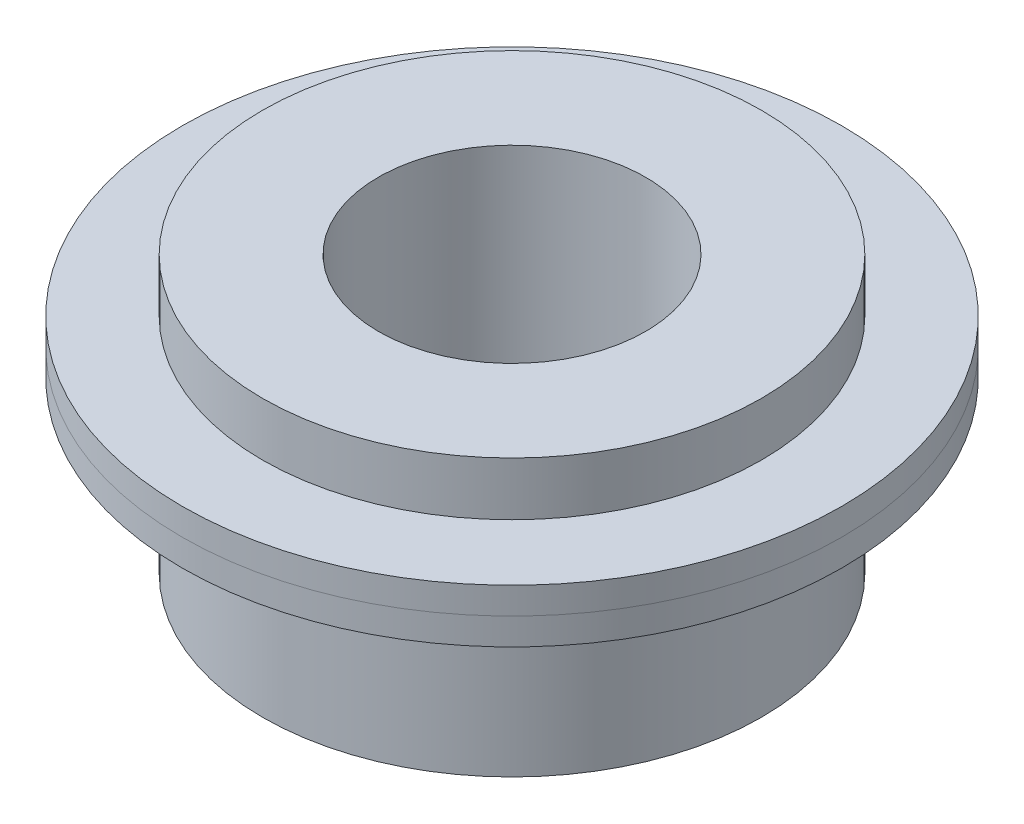
ISO-10303-21;
HEADER;
FILE_DESCRIPTION(('STEP AP214'),'2;1');
FILE_NAME('part.step','',(''),(''),'','','');
FILE_SCHEMA(('AUTOMOTIVE_DESIGN { 1 0 10303 214 1 1 1 1 }'));
ENDSEC;
DATA;
#1=APPLICATION_CONTEXT('core data for automotive mechanical design processes');
#2=APPLICATION_PROTOCOL_DEFINITION('international standard','automotive_design',2000,#1);
#3=PRODUCT_CONTEXT('',#1,'mechanical');
#4=PRODUCT('Part','Part','',(#3));
#5=PRODUCT_RELATED_PRODUCT_CATEGORY('part','',(#4));
#6=PRODUCT_DEFINITION_FORMATION('','',#4);
#7=PRODUCT_DEFINITION_CONTEXT('part definition',#1,'design');
#8=PRODUCT_DEFINITION('design','',#6,#7);
#9=PRODUCT_DEFINITION_SHAPE('','',#8);
#10=(LENGTH_UNIT() NAMED_UNIT(*) SI_UNIT(.MILLI.,.METRE.));
#11=(NAMED_UNIT(*) PLANE_ANGLE_UNIT() SI_UNIT($,.RADIAN.));
#12=(NAMED_UNIT(*) SI_UNIT($,.STERADIAN.) SOLID_ANGLE_UNIT());
#13=UNCERTAINTY_MEASURE_WITH_UNIT(LENGTH_MEASURE(1.E-05),#10,'distance_accuracy_value','');
#14=(GEOMETRIC_REPRESENTATION_CONTEXT(3) GLOBAL_UNCERTAINTY_ASSIGNED_CONTEXT((#13)) GLOBAL_UNIT_ASSIGNED_CONTEXT((#10,
#11,#12)) REPRESENTATION_CONTEXT('',''));
#15=CARTESIAN_POINT('',(0.,0.,0.));
#16=DIRECTION('',(0.,0.,1.));
#17=DIRECTION('',(1.,0.,0.));
#18=AXIS2_PLACEMENT_3D('',#15,#16,#17);
#19=CARTESIAN_POINT('',(0.,-1.44701986754967,0.));
#20=DIRECTION('',(0.,1.,0.));
#21=DIRECTION('',(0.,0.,1.));
#22=AXIS2_PLACEMENT_3D('',#19,#20,#21);
#23=CYLINDRICAL_SURFACE('',#22,18.5);
#24=CARTESIAN_POINT('',(0.,-1.44701986754967,0.));
#25=DIRECTION('',(0.,-1.,0.));
#26=DIRECTION('',(0.,0.,-1.));
#27=AXIS2_PLACEMENT_3D('',#24,#25,#26);
#28=CIRCLE('',#27,18.5);
#29=CARTESIAN_POINT('',(0.,-1.44701986754967,-18.5));
#30=VERTEX_POINT('',#29);
#31=EDGE_CURVE('E54',#30,#30,#28,.T.);
#32=ORIENTED_EDGE('',*,*,#31,.F.);
#33=EDGE_LOOP('',(#32));
#34=FACE_BOUND('',#33,.T.);
#35=CARTESIAN_POINT('',(0.,0.0529801324503314,0.));
#36=DIRECTION('',(0.,-1.,0.));
#37=DIRECTION('',(0.,0.,-1.));
#38=AXIS2_PLACEMENT_3D('',#35,#36,#37);
#39=CIRCLE('',#38,18.5);
#40=CARTESIAN_POINT('',(0.,0.0529801324503314,-18.5));
#41=VERTEX_POINT('',#40);
#42=EDGE_CURVE('E60',#41,#41,#39,.T.);
#43=ORIENTED_EDGE('',*,*,#42,.T.);
#44=EDGE_LOOP('',(#43));
#45=FACE_BOUND('',#44,.T.);
#46=ADVANCED_FACE('F47',(#34,#45),#23,.T.);
#47=CARTESIAN_POINT('',(0.,-1.44701986754967,0.));
#48=DIRECTION('',(0.,1.,0.));
#49=DIRECTION('',(0.,0.,1.));
#50=AXIS2_PLACEMENT_3D('',#47,#48,#49);
#51=CYLINDRICAL_SURFACE('',#50,14.);
#52=CARTESIAN_POINT('',(0.,-1.44701986754967,0.));
#53=DIRECTION('',(0.,-1.,0.));
#54=DIRECTION('',(0.,0.,-1.));
#55=AXIS2_PLACEMENT_3D('',#52,#53,#54);
#56=CIRCLE('',#55,14.);
#57=CARTESIAN_POINT('',(0.,-1.44701986754967,-14.));
#58=VERTEX_POINT('',#57);
#59=EDGE_CURVE('E11',#58,#58,#56,.F.);
#60=ORIENTED_EDGE('',*,*,#59,.F.);
#61=EDGE_LOOP('',(#60));
#62=FACE_BOUND('',#61,.T.);
#63=CARTESIAN_POINT('',(0.,0.0529801324503314,0.));
#64=DIRECTION('',(0.,-1.,0.));
#65=DIRECTION('',(0.,0.,-1.));
#66=AXIS2_PLACEMENT_3D('',#63,#64,#65);
#67=CIRCLE('',#66,14.);
#68=CARTESIAN_POINT('',(0.,0.0529801324503314,-14.));
#69=VERTEX_POINT('',#68);
#70=EDGE_CURVE('E50',#69,#69,#67,.F.);
#71=ORIENTED_EDGE('',*,*,#70,.T.);
#72=EDGE_LOOP('',(#71));
#73=FACE_BOUND('',#72,.T.);
#74=ADVANCED_FACE('F67',(#62,#73),#51,.F.);
#75=CARTESIAN_POINT('',(0.,-1.44701986754967,0.));
#76=DIRECTION('',(0.,-1.,0.));
#77=DIRECTION('',(0.,0.,-1.));
#78=AXIS2_PLACEMENT_3D('',#75,#76,#77);
#79=PLANE('',#78);
#80=ORIENTED_EDGE('',*,*,#31,.T.);
#81=EDGE_LOOP('',(#80));
#82=FACE_BOUND('',#81,.T.);
#83=ORIENTED_EDGE('',*,*,#59,.T.);
#84=EDGE_LOOP('',(#83));
#85=FACE_BOUND('',#84,.T.);
#86=ADVANCED_FACE('F71',(#82,#85),#79,.T.);
#87=CARTESIAN_POINT('',(0.,0.0529801324503314,0.));
#88=DIRECTION('',(0.,-1.,0.));
#89=DIRECTION('',(0.,0.,-1.));
#90=AXIS2_PLACEMENT_3D('',#87,#88,#89);
#91=PLANE('',#90);
#92=ORIENTED_EDGE('',*,*,#42,.F.);
#93=EDGE_LOOP('',(#92));
#94=FACE_BOUND('',#93,.T.);
#95=ORIENTED_EDGE('',*,*,#70,.F.);
#96=EDGE_LOOP('',(#95));
#97=FACE_BOUND('',#96,.T.);
#98=ADVANCED_FACE('F69',(#94,#97),#91,.F.);
#99=CLOSED_SHELL('',(#46,#74,#86,#98));
#100=MANIFOLD_SOLID_BREP('B2',#99);
#101=CARTESIAN_POINT('',(0.,7.46688741721854,0.));
#102=DIRECTION('',(0.,1.,0.));
#103=DIRECTION('',(0.,0.,1.));
#104=AXIS2_PLACEMENT_3D('',#101,#102,#103);
#105=CYLINDRICAL_SURFACE('',#104,7.5);
#106=CARTESIAN_POINT('',(0.,4.55298013245033,0.));
#107=DIRECTION('',(0.,1.,0.));
#108=DIRECTION('',(0.,0.,1.));
#109=AXIS2_PLACEMENT_3D('',#106,#107,#108);
#110=CIRCLE('',#109,7.5);
#111=CARTESIAN_POINT('',(0.,4.55298013245033,7.5));
#112=VERTEX_POINT('',#111);
#113=EDGE_CURVE('E46',#112,#112,#110,.T.);
#114=ORIENTED_EDGE('',*,*,#113,.T.);
#115=EDGE_LOOP('',(#114));
#116=FACE_BOUND('',#115,.T.);
#117=CARTESIAN_POINT('',(0.,-10.9470198675497,0.));
#118=DIRECTION('',(0.,1.,0.));
#119=DIRECTION('',(0.,0.,1.));
#120=AXIS2_PLACEMENT_3D('',#117,#118,#119);
#121=CIRCLE('',#120,7.5);
#122=CARTESIAN_POINT('',(0.,-10.9470198675497,7.5));
#123=VERTEX_POINT('',#122);
#124=EDGE_CURVE('E140',#123,#123,#121,.T.);
#125=ORIENTED_EDGE('',*,*,#124,.F.);
#126=EDGE_LOOP('',(#125));
#127=FACE_BOUND('',#126,.T.);
#128=ADVANCED_FACE('F112',(#116,#127),#105,.F.);
#129=CARTESIAN_POINT('',(-7.5,4.55298013245033,0.));
#130=DIRECTION('',(0.,1.,0.));
#131=DIRECTION('',(0.,0.,1.));
#132=AXIS2_PLACEMENT_3D('',#129,#130,#131);
#133=PLANE('',#132);
#134=CARTESIAN_POINT('',(0.,4.55298013245033,0.));
#135=DIRECTION('',(0.,1.,0.));
#136=DIRECTION('',(0.,0.,1.));
#137=AXIS2_PLACEMENT_3D('',#134,#135,#136);
#138=CIRCLE('',#137,14.);
#139=CARTESIAN_POINT('',(0.,4.55298013245033,14.));
#140=VERTEX_POINT('',#139);
#141=EDGE_CURVE('E118',#140,#140,#138,.T.);
#142=ORIENTED_EDGE('',*,*,#141,.T.);
#143=EDGE_LOOP('',(#142));
#144=FACE_BOUND('',#143,.T.);
#145=ORIENTED_EDGE('',*,*,#113,.F.);
#146=EDGE_LOOP('',(#145));
#147=FACE_BOUND('',#146,.T.);
#148=ADVANCED_FACE('F148',(#144,#147),#133,.T.);
#149=CARTESIAN_POINT('',(0.,7.46688741721854,0.));
#150=DIRECTION('',(0.,1.,0.));
#151=DIRECTION('',(0.,0.,1.));
#152=AXIS2_PLACEMENT_3D('',#149,#150,#151);
#153=CYLINDRICAL_SURFACE('',#152,14.);
#154=CARTESIAN_POINT('',(0.,1.55298013245033,0.));
#155=DIRECTION('',(0.,1.,0.));
#156=DIRECTION('',(0.,0.,1.));
#157=AXIS2_PLACEMENT_3D('',#154,#155,#156);
#158=CIRCLE('',#157,14.);
#159=CARTESIAN_POINT('',(0.,1.55298013245033,14.));
#160=VERTEX_POINT('',#159);
#161=EDGE_CURVE('E122',#160,#160,#158,.T.);
#162=ORIENTED_EDGE('',*,*,#161,.T.);
#163=EDGE_LOOP('',(#162));
#164=FACE_BOUND('',#163,.T.);
#165=ORIENTED_EDGE('',*,*,#141,.F.);
#166=EDGE_LOOP('',(#165));
#167=FACE_BOUND('',#166,.T.);
#168=ADVANCED_FACE('F152',(#164,#167),#153,.T.);
#169=CARTESIAN_POINT('',(-14.,1.55298013245033,0.));
#170=DIRECTION('',(0.,1.,0.));
#171=DIRECTION('',(0.,0.,1.));
#172=AXIS2_PLACEMENT_3D('',#169,#170,#171);
#173=PLANE('',#172);
#174=CARTESIAN_POINT('',(0.,1.55298013245033,0.));
#175=DIRECTION('',(0.,1.,0.));
#176=DIRECTION('',(0.,0.,1.));
#177=AXIS2_PLACEMENT_3D('',#174,#175,#176);
#178=CIRCLE('',#177,18.5);
#179=CARTESIAN_POINT('',(0.,1.55298013245033,18.5));
#180=VERTEX_POINT('',#179);
#181=EDGE_CURVE('E126',#180,#180,#178,.T.);
#182=ORIENTED_EDGE('',*,*,#181,.T.);
#183=EDGE_LOOP('',(#182));
#184=FACE_BOUND('',#183,.T.);
#185=ORIENTED_EDGE('',*,*,#161,.F.);
#186=EDGE_LOOP('',(#185));
#187=FACE_BOUND('',#186,.T.);
#188=ADVANCED_FACE('F156',(#184,#187),#173,.T.);
#189=CARTESIAN_POINT('',(0.,7.46688741721854,0.));
#190=DIRECTION('',(0.,1.,0.));
#191=DIRECTION('',(0.,0.,1.));
#192=AXIS2_PLACEMENT_3D('',#189,#190,#191);
#193=CYLINDRICAL_SURFACE('',#192,18.5);
#194=CARTESIAN_POINT('',(0.,0.0529801324503313,0.));
#195=DIRECTION('',(0.,1.,0.));
#196=DIRECTION('',(0.,0.,1.));
#197=AXIS2_PLACEMENT_3D('',#194,#195,#196);
#198=CIRCLE('',#197,18.5);
#199=CARTESIAN_POINT('',(0.,0.0529801324503313,18.5));
#200=VERTEX_POINT('',#199);
#201=EDGE_CURVE('E131',#200,#200,#198,.T.);
#202=ORIENTED_EDGE('',*,*,#201,.T.);
#203=EDGE_LOOP('',(#202));
#204=FACE_BOUND('',#203,.T.);
#205=ORIENTED_EDGE('',*,*,#181,.F.);
#206=EDGE_LOOP('',(#205));
#207=FACE_BOUND('',#206,.T.);
#208=ADVANCED_FACE('F163',(#204,#207),#193,.T.);
#209=CARTESIAN_POINT('',(-14.,0.0529801324503314,0.));
#210=DIRECTION('',(0.,-1.,0.));
#211=DIRECTION('',(0.,0.,-1.));
#212=AXIS2_PLACEMENT_3D('',#209,#210,#211);
#213=PLANE('',#212);
#214=CARTESIAN_POINT('',(0.,0.0529801324503313,0.));
#215=DIRECTION('',(0.,1.,0.));
#216=DIRECTION('',(0.,0.,1.));
#217=AXIS2_PLACEMENT_3D('',#214,#215,#216);
#218=CIRCLE('',#217,14.);
#219=CARTESIAN_POINT('',(0.,0.0529801324503313,14.));
#220=VERTEX_POINT('',#219);
#221=EDGE_CURVE('E134',#220,#220,#218,.T.);
#222=ORIENTED_EDGE('',*,*,#221,.T.);
#223=EDGE_LOOP('',(#222));
#224=FACE_BOUND('',#223,.T.);
#225=ORIENTED_EDGE('',*,*,#201,.F.);
#226=EDGE_LOOP('',(#225));
#227=FACE_BOUND('',#226,.T.);
#228=ADVANCED_FACE('F167',(#224,#227),#213,.T.);
#229=CARTESIAN_POINT('',(0.,7.46688741721854,0.));
#230=DIRECTION('',(0.,1.,0.));
#231=DIRECTION('',(0.,0.,1.));
#232=AXIS2_PLACEMENT_3D('',#229,#230,#231);
#233=CYLINDRICAL_SURFACE('',#232,14.);
#234=CARTESIAN_POINT('',(0.,-10.9470198675497,0.));
#235=DIRECTION('',(0.,1.,0.));
#236=DIRECTION('',(0.,0.,1.));
#237=AXIS2_PLACEMENT_3D('',#234,#235,#236);
#238=CIRCLE('',#237,14.);
#239=CARTESIAN_POINT('',(0.,-10.9470198675497,14.));
#240=VERTEX_POINT('',#239);
#241=EDGE_CURVE('E137',#240,#240,#238,.T.);
#242=ORIENTED_EDGE('',*,*,#241,.T.);
#243=EDGE_LOOP('',(#242));
#244=FACE_BOUND('',#243,.T.);
#245=ORIENTED_EDGE('',*,*,#221,.F.);
#246=EDGE_LOOP('',(#245));
#247=FACE_BOUND('',#246,.T.);
#248=ADVANCED_FACE('F171',(#244,#247),#233,.T.);
#249=CARTESIAN_POINT('',(-14.,-10.9470198675497,0.));
#250=DIRECTION('',(0.,-1.,0.));
#251=DIRECTION('',(0.,0.,-1.));
#252=AXIS2_PLACEMENT_3D('',#249,#250,#251);
#253=PLANE('',#252);
#254=ORIENTED_EDGE('',*,*,#124,.T.);
#255=EDGE_LOOP('',(#254));
#256=FACE_BOUND('',#255,.T.);
#257=ORIENTED_EDGE('',*,*,#241,.F.);
#258=EDGE_LOOP('',(#257));
#259=FACE_BOUND('',#258,.T.);
#260=ADVANCED_FACE('F144',(#256,#259),#253,.T.);
#261=CLOSED_SHELL('',(#128,#148,#168,#188,#208,#228,#248,#260));
#262=MANIFOLD_SOLID_BREP('B6',#261);
#263=ADVANCED_BREP_SHAPE_REPRESENTATION('',(#18,#100,#262),#14);
#264=SHAPE_DEFINITION_REPRESENTATION(#9,#263);
ENDSEC;
END-ISO-10303-21;
